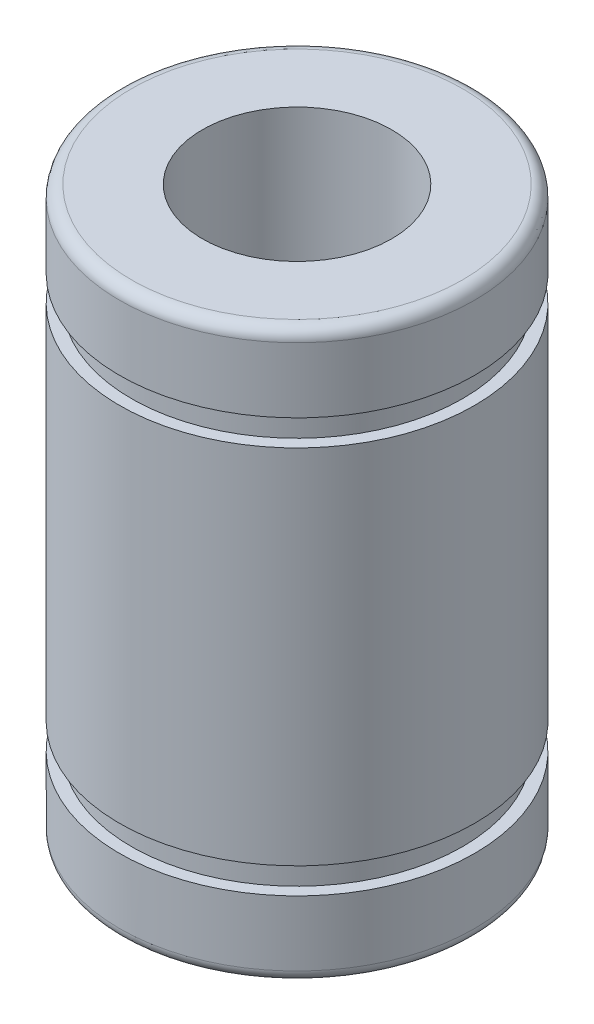
ISO-10303-21;
HEADER;
FILE_DESCRIPTION(('STEP AP214'),'2;1');
FILE_NAME('part.step','',(''),(''),'','','');
FILE_SCHEMA(('AUTOMOTIVE_DESIGN { 1 0 10303 214 1 1 1 1 }'));
ENDSEC;
DATA;
#1=APPLICATION_CONTEXT('core data for automotive mechanical design processes');
#2=APPLICATION_PROTOCOL_DEFINITION('international standard','automotive_design',2000,#1);
#3=PRODUCT_CONTEXT('',#1,'mechanical');
#4=PRODUCT('Part','Part','',(#3));
#5=PRODUCT_RELATED_PRODUCT_CATEGORY('part','',(#4));
#6=PRODUCT_DEFINITION_FORMATION('','',#4);
#7=PRODUCT_DEFINITION_CONTEXT('part definition',#1,'design');
#8=PRODUCT_DEFINITION('design','',#6,#7);
#9=PRODUCT_DEFINITION_SHAPE('','',#8);
#10=(LENGTH_UNIT() NAMED_UNIT(*) SI_UNIT(.MILLI.,.METRE.));
#11=(NAMED_UNIT(*) PLANE_ANGLE_UNIT() SI_UNIT($,.RADIAN.));
#12=(NAMED_UNIT(*) SI_UNIT($,.STERADIAN.) SOLID_ANGLE_UNIT());
#13=UNCERTAINTY_MEASURE_WITH_UNIT(LENGTH_MEASURE(1.E-05),#10,'distance_accuracy_value','');
#14=(GEOMETRIC_REPRESENTATION_CONTEXT(3) GLOBAL_UNCERTAINTY_ASSIGNED_CONTEXT((#13)) GLOBAL_UNIT_ASSIGNED_CONTEXT((#10,
#11,#12)) REPRESENTATION_CONTEXT('',''));
#15=CARTESIAN_POINT('',(0.,0.,0.));
#16=DIRECTION('',(0.,0.,1.));
#17=DIRECTION('',(1.,0.,0.));
#18=AXIS2_PLACEMENT_3D('',#15,#16,#17);
#19=CARTESIAN_POINT('',(0.,0.,0.));
#20=DIRECTION('',(0.,-1.,0.));
#21=DIRECTION('',(1.,0.,0.));
#22=AXIS2_PLACEMENT_3D('',#19,#20,#21);
#23=CYLINDRICAL_SURFACE('',#22,4.);
#24=CARTESIAN_POINT('',(0.,12.,0.));
#25=DIRECTION('',(0.,-1.,0.));
#26=DIRECTION('',(1.,0.,0.));
#27=AXIS2_PLACEMENT_3D('',#24,#25,#26);
#28=CIRCLE('',#27,4.);
#29=CARTESIAN_POINT('',(4.,12.,0.));
#30=VERTEX_POINT('',#29);
#31=EDGE_CURVE('E78',#30,#30,#28,.T.);
#32=ORIENTED_EDGE('',*,*,#31,.F.);
#33=EDGE_LOOP('',(#32));
#34=FACE_BOUND('',#33,.T.);
#35=CARTESIAN_POINT('',(0.,-12.,0.));
#36=DIRECTION('',(0.,-1.,0.));
#37=DIRECTION('',(1.,0.,0.));
#38=AXIS2_PLACEMENT_3D('',#35,#36,#37);
#39=CIRCLE('',#38,4.);
#40=CARTESIAN_POINT('',(4.,-12.,0.));
#41=VERTEX_POINT('',#40);
#42=EDGE_CURVE('E51',#41,#41,#39,.T.);
#43=ORIENTED_EDGE('',*,*,#42,.T.);
#44=EDGE_LOOP('',(#43));
#45=FACE_BOUND('',#44,.T.);
#46=ADVANCED_FACE('F31',(#34,#45),#23,.F.);
#47=CARTESIAN_POINT('',(-4.,-12.,0.));
#48=DIRECTION('',(0.,1.,0.));
#49=DIRECTION('',(-1.,0.,0.));
#50=AXIS2_PLACEMENT_3D('',#47,#48,#49);
#51=PLANE('',#50);
#52=CARTESIAN_POINT('',(0.,-12.,0.));
#53=DIRECTION('',(0.,1.,0.));
#54=DIRECTION('',(-1.,0.,0.));
#55=AXIS2_PLACEMENT_3D('',#52,#53,#54);
#56=CIRCLE('',#55,7.);
#57=CARTESIAN_POINT('',(-7.,-12.,0.));
#58=VERTEX_POINT('',#57);
#59=EDGE_CURVE('E46',#58,#58,#56,.F.);
#60=ORIENTED_EDGE('',*,*,#59,.T.);
#61=EDGE_LOOP('',(#60));
#62=FACE_BOUND('',#61,.T.);
#63=ORIENTED_EDGE('',*,*,#42,.F.);
#64=EDGE_LOOP('',(#63));
#65=FACE_BOUND('',#64,.T.);
#66=ADVANCED_FACE('F86',(#62,#65),#51,.F.);
#67=CARTESIAN_POINT('',(0.,0.,0.));
#68=DIRECTION('',(0.,-1.,0.));
#69=DIRECTION('',(1.,0.,0.));
#70=AXIS2_PLACEMENT_3D('',#67,#68,#69);
#71=CYLINDRICAL_SURFACE('',#70,7.5);
#72=CARTESIAN_POINT('',(0.,-11.5,0.));
#73=DIRECTION('',(0.,1.,0.));
#74=DIRECTION('',(-1.,0.,0.));
#75=AXIS2_PLACEMENT_3D('',#72,#73,#74);
#76=CIRCLE('',#75,7.5);
#77=CARTESIAN_POINT('',(-7.5,-11.5,0.));
#78=VERTEX_POINT('',#77);
#79=EDGE_CURVE('E42',#78,#78,#76,.T.);
#80=ORIENTED_EDGE('',*,*,#79,.T.);
#81=EDGE_LOOP('',(#80));
#82=FACE_BOUND('',#81,.T.);
#83=CARTESIAN_POINT('',(0.,-8.75,0.));
#84=DIRECTION('',(0.,-1.,0.));
#85=DIRECTION('',(1.,0.,0.));
#86=AXIS2_PLACEMENT_3D('',#83,#84,#85);
#87=CIRCLE('',#86,7.5);
#88=CARTESIAN_POINT('',(7.5,-8.75,0.));
#89=VERTEX_POINT('',#88);
#90=EDGE_CURVE('E54',#89,#89,#87,.T.);
#91=ORIENTED_EDGE('',*,*,#90,.T.);
#92=EDGE_LOOP('',(#91));
#93=FACE_BOUND('',#92,.T.);
#94=ADVANCED_FACE('F91',(#82,#93),#71,.T.);
#95=CARTESIAN_POINT('',(-7.5,-8.75,0.));
#96=DIRECTION('',(0.,-1.,0.));
#97=DIRECTION('',(1.,0.,0.));
#98=AXIS2_PLACEMENT_3D('',#95,#96,#97);
#99=PLANE('',#98);
#100=ORIENTED_EDGE('',*,*,#90,.F.);
#101=EDGE_LOOP('',(#100));
#102=FACE_BOUND('',#101,.T.);
#103=CARTESIAN_POINT('',(0.,-8.75,0.));
#104=DIRECTION('',(0.,-1.,0.));
#105=DIRECTION('',(1.,0.,0.));
#106=AXIS2_PLACEMENT_3D('',#103,#104,#105);
#107=CIRCLE('',#106,7.);
#108=CARTESIAN_POINT('',(7.,-8.75,0.));
#109=VERTEX_POINT('',#108);
#110=EDGE_CURVE('E57',#109,#109,#107,.T.);
#111=ORIENTED_EDGE('',*,*,#110,.T.);
#112=EDGE_LOOP('',(#111));
#113=FACE_BOUND('',#112,.T.);
#114=ADVANCED_FACE('F97',(#102,#113),#99,.F.);
#115=CARTESIAN_POINT('',(0.,0.,0.));
#116=DIRECTION('',(0.,-1.,0.));
#117=DIRECTION('',(1.,0.,0.));
#118=AXIS2_PLACEMENT_3D('',#115,#116,#117);
#119=CYLINDRICAL_SURFACE('',#118,7.);
#120=ORIENTED_EDGE('',*,*,#110,.F.);
#121=EDGE_LOOP('',(#120));
#122=FACE_BOUND('',#121,.T.);
#123=CARTESIAN_POINT('',(0.,-7.65,0.));
#124=DIRECTION('',(0.,-1.,0.));
#125=DIRECTION('',(1.,0.,0.));
#126=AXIS2_PLACEMENT_3D('',#123,#124,#125);
#127=CIRCLE('',#126,7.);
#128=CARTESIAN_POINT('',(7.,-7.65,0.));
#129=VERTEX_POINT('',#128);
#130=EDGE_CURVE('E60',#129,#129,#127,.T.);
#131=ORIENTED_EDGE('',*,*,#130,.T.);
#132=EDGE_LOOP('',(#131));
#133=FACE_BOUND('',#132,.T.);
#134=ADVANCED_FACE('F119',(#122,#133),#119,.T.);
#135=CARTESIAN_POINT('',(-7.,-7.65,0.));
#136=DIRECTION('',(0.,1.,0.));
#137=DIRECTION('',(-1.,0.,0.));
#138=AXIS2_PLACEMENT_3D('',#135,#136,#137);
#139=PLANE('',#138);
#140=ORIENTED_EDGE('',*,*,#130,.F.);
#141=EDGE_LOOP('',(#140));
#142=FACE_BOUND('',#141,.T.);
#143=CARTESIAN_POINT('',(0.,-7.65,0.));
#144=DIRECTION('',(0.,-1.,0.));
#145=DIRECTION('',(1.,0.,0.));
#146=AXIS2_PLACEMENT_3D('',#143,#144,#145);
#147=CIRCLE('',#146,7.5);
#148=CARTESIAN_POINT('',(7.5,-7.65,0.));
#149=VERTEX_POINT('',#148);
#150=EDGE_CURVE('E63',#149,#149,#147,.T.);
#151=ORIENTED_EDGE('',*,*,#150,.T.);
#152=EDGE_LOOP('',(#151));
#153=FACE_BOUND('',#152,.T.);
#154=ADVANCED_FACE('F124',(#142,#153),#139,.F.);
#155=CARTESIAN_POINT('',(0.,0.,0.));
#156=DIRECTION('',(0.,-1.,0.));
#157=DIRECTION('',(1.,0.,0.));
#158=AXIS2_PLACEMENT_3D('',#155,#156,#157);
#159=CYLINDRICAL_SURFACE('',#158,7.5);
#160=ORIENTED_EDGE('',*,*,#150,.F.);
#161=EDGE_LOOP('',(#160));
#162=FACE_BOUND('',#161,.T.);
#163=CARTESIAN_POINT('',(0.,7.65,0.));
#164=DIRECTION('',(0.,-1.,0.));
#165=DIRECTION('',(1.,0.,0.));
#166=AXIS2_PLACEMENT_3D('',#163,#164,#165);
#167=CIRCLE('',#166,7.5);
#168=CARTESIAN_POINT('',(7.5,7.65,0.));
#169=VERTEX_POINT('',#168);
#170=EDGE_CURVE('E66',#169,#169,#167,.T.);
#171=ORIENTED_EDGE('',*,*,#170,.T.);
#172=EDGE_LOOP('',(#171));
#173=FACE_BOUND('',#172,.T.);
#174=ADVANCED_FACE('F130',(#162,#173),#159,.T.);
#175=CARTESIAN_POINT('',(-7.,7.65,0.));
#176=DIRECTION('',(0.,-1.,0.));
#177=DIRECTION('',(1.,0.,0.));
#178=AXIS2_PLACEMENT_3D('',#175,#176,#177);
#179=PLANE('',#178);
#180=ORIENTED_EDGE('',*,*,#170,.F.);
#181=EDGE_LOOP('',(#180));
#182=FACE_BOUND('',#181,.T.);
#183=CARTESIAN_POINT('',(0.,7.65,0.));
#184=DIRECTION('',(0.,-1.,0.));
#185=DIRECTION('',(1.,0.,0.));
#186=AXIS2_PLACEMENT_3D('',#183,#184,#185);
#187=CIRCLE('',#186,7.);
#188=CARTESIAN_POINT('',(7.,7.65,0.));
#189=VERTEX_POINT('',#188);
#190=EDGE_CURVE('E69',#189,#189,#187,.T.);
#191=ORIENTED_EDGE('',*,*,#190,.T.);
#192=EDGE_LOOP('',(#191));
#193=FACE_BOUND('',#192,.T.);
#194=ADVANCED_FACE('F136',(#182,#193),#179,.F.);
#195=CARTESIAN_POINT('',(0.,0.,0.));
#196=DIRECTION('',(0.,-1.,0.));
#197=DIRECTION('',(1.,0.,0.));
#198=AXIS2_PLACEMENT_3D('',#195,#196,#197);
#199=CYLINDRICAL_SURFACE('',#198,7.);
#200=ORIENTED_EDGE('',*,*,#190,.F.);
#201=EDGE_LOOP('',(#200));
#202=FACE_BOUND('',#201,.T.);
#203=CARTESIAN_POINT('',(0.,8.75,0.));
#204=DIRECTION('',(0.,-1.,0.));
#205=DIRECTION('',(1.,0.,0.));
#206=AXIS2_PLACEMENT_3D('',#203,#204,#205);
#207=CIRCLE('',#206,7.);
#208=CARTESIAN_POINT('',(7.,8.75,0.));
#209=VERTEX_POINT('',#208);
#210=EDGE_CURVE('E72',#209,#209,#207,.T.);
#211=ORIENTED_EDGE('',*,*,#210,.T.);
#212=EDGE_LOOP('',(#211));
#213=FACE_BOUND('',#212,.T.);
#214=ADVANCED_FACE('F142',(#202,#213),#199,.T.);
#215=CARTESIAN_POINT('',(-7.5,8.75,0.));
#216=DIRECTION('',(0.,1.,0.));
#217=DIRECTION('',(-1.,0.,0.));
#218=AXIS2_PLACEMENT_3D('',#215,#216,#217);
#219=PLANE('',#218);
#220=ORIENTED_EDGE('',*,*,#210,.F.);
#221=EDGE_LOOP('',(#220));
#222=FACE_BOUND('',#221,.T.);
#223=CARTESIAN_POINT('',(0.,8.75,0.));
#224=DIRECTION('',(0.,-1.,0.));
#225=DIRECTION('',(1.,0.,0.));
#226=AXIS2_PLACEMENT_3D('',#223,#224,#225);
#227=CIRCLE('',#226,7.5);
#228=CARTESIAN_POINT('',(7.5,8.75,0.));
#229=VERTEX_POINT('',#228);
#230=EDGE_CURVE('E75',#229,#229,#227,.T.);
#231=ORIENTED_EDGE('',*,*,#230,.T.);
#232=EDGE_LOOP('',(#231));
#233=FACE_BOUND('',#232,.T.);
#234=ADVANCED_FACE('F148',(#222,#233),#219,.F.);
#235=CARTESIAN_POINT('',(0.,0.,0.));
#236=DIRECTION('',(0.,-1.,0.));
#237=DIRECTION('',(1.,0.,0.));
#238=AXIS2_PLACEMENT_3D('',#235,#236,#237);
#239=CYLINDRICAL_SURFACE('',#238,7.5);
#240=CARTESIAN_POINT('',(0.,11.5,0.));
#241=DIRECTION('',(0.,-1.,0.));
#242=DIRECTION('',(1.,0.,0.));
#243=AXIS2_PLACEMENT_3D('',#240,#241,#242);
#244=CIRCLE('',#243,7.5);
#245=CARTESIAN_POINT('',(7.5,11.5,0.));
#246=VERTEX_POINT('',#245);
#247=EDGE_CURVE('E38',#246,#246,#244,.T.);
#248=ORIENTED_EDGE('',*,*,#247,.T.);
#249=EDGE_LOOP('',(#248));
#250=FACE_BOUND('',#249,.T.);
#251=ORIENTED_EDGE('',*,*,#230,.F.);
#252=EDGE_LOOP('',(#251));
#253=FACE_BOUND('',#252,.T.);
#254=ADVANCED_FACE('F109',(#250,#253),#239,.T.);
#255=CARTESIAN_POINT('',(-4.,12.,0.));
#256=DIRECTION('',(0.,-1.,0.));
#257=DIRECTION('',(1.,0.,0.));
#258=AXIS2_PLACEMENT_3D('',#255,#256,#257);
#259=PLANE('',#258);
#260=CARTESIAN_POINT('',(0.,12.,0.));
#261=DIRECTION('',(0.,-1.,0.));
#262=DIRECTION('',(1.,0.,0.));
#263=AXIS2_PLACEMENT_3D('',#260,#261,#262);
#264=CIRCLE('',#263,7.);
#265=CARTESIAN_POINT('',(7.,12.,0.));
#266=VERTEX_POINT('',#265);
#267=EDGE_CURVE('E10',#266,#266,#264,.F.);
#268=ORIENTED_EDGE('',*,*,#267,.T.);
#269=EDGE_LOOP('',(#268));
#270=FACE_BOUND('',#269,.T.);
#271=ORIENTED_EDGE('',*,*,#31,.T.);
#272=EDGE_LOOP('',(#271));
#273=FACE_BOUND('',#272,.T.);
#274=ADVANCED_FACE('F82',(#270,#273),#259,.F.);
#275=CARTESIAN_POINT('',(0.,-11.5,0.));
#276=DIRECTION('',(0.,1.,0.));
#277=DIRECTION('',(-1.,0.,0.));
#278=AXIS2_PLACEMENT_3D('',#275,#276,#277);
#279=TOROIDAL_SURFACE('',#278,7.,0.5);
#280=ORIENTED_EDGE('',*,*,#79,.F.);
#281=EDGE_LOOP('',(#280));
#282=FACE_BOUND('',#281,.T.);
#283=ORIENTED_EDGE('',*,*,#59,.F.);
#284=EDGE_LOOP('',(#283));
#285=FACE_BOUND('',#284,.T.);
#286=ADVANCED_FACE('F101',(#282,#285),#279,.T.);
#287=CARTESIAN_POINT('',(0.,11.5,0.));
#288=DIRECTION('',(0.,-1.,0.));
#289=DIRECTION('',(1.,0.,0.));
#290=AXIS2_PLACEMENT_3D('',#287,#288,#289);
#291=TOROIDAL_SURFACE('',#290,7.,0.5);
#292=ORIENTED_EDGE('',*,*,#267,.F.);
#293=EDGE_LOOP('',(#292));
#294=FACE_BOUND('',#293,.T.);
#295=ORIENTED_EDGE('',*,*,#247,.F.);
#296=EDGE_LOOP('',(#295));
#297=FACE_BOUND('',#296,.T.);
#298=ADVANCED_FACE('F33',(#294,#297),#291,.T.);
#299=CLOSED_SHELL('',(#46,#66,#94,#114,#134,#154,#174,#194,#214,#234,#254,#274,#286,#298));
#300=MANIFOLD_SOLID_BREP('B2',#299);
#301=ADVANCED_BREP_SHAPE_REPRESENTATION('',(#18,#300),#14);
#302=SHAPE_DEFINITION_REPRESENTATION(#9,#301);
ENDSEC;
END-ISO-10303-21;
